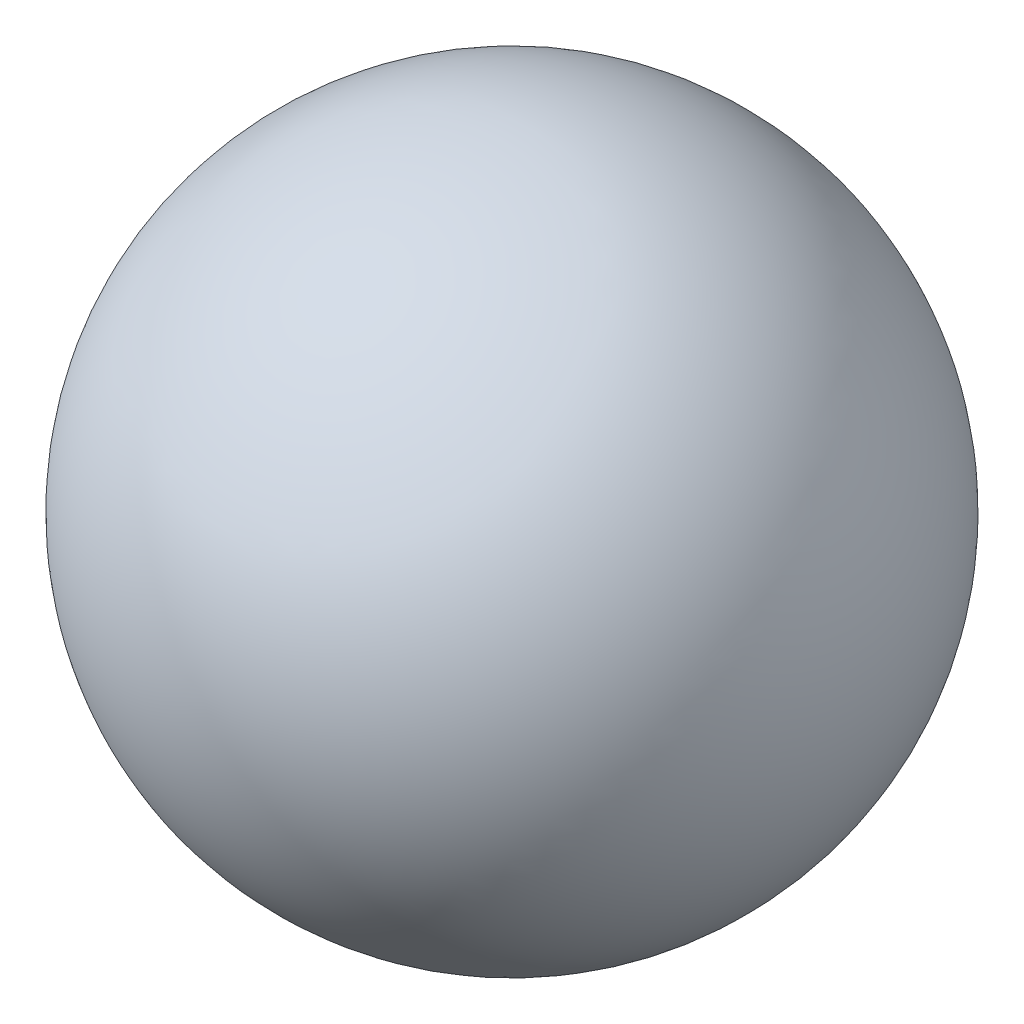
ISO-10303-21;
HEADER;
FILE_DESCRIPTION(('STEP AP214'),'2;1');
FILE_NAME('part.step','',(''),(''),'','','');
FILE_SCHEMA(('AUTOMOTIVE_DESIGN { 1 0 10303 214 1 1 1 1 }'));
ENDSEC;
DATA;
#1=APPLICATION_CONTEXT('core data for automotive mechanical design processes');
#2=APPLICATION_PROTOCOL_DEFINITION('international standard','automotive_design',2000,#1);
#3=PRODUCT_CONTEXT('',#1,'mechanical');
#4=PRODUCT('Part','Part','',(#3));
#5=PRODUCT_RELATED_PRODUCT_CATEGORY('part','',(#4));
#6=PRODUCT_DEFINITION_FORMATION('','',#4);
#7=PRODUCT_DEFINITION_CONTEXT('part definition',#1,'design');
#8=PRODUCT_DEFINITION('design','',#6,#7);
#9=PRODUCT_DEFINITION_SHAPE('','',#8);
#10=(LENGTH_UNIT() NAMED_UNIT(*) SI_UNIT(.MILLI.,.METRE.));
#11=(NAMED_UNIT(*) PLANE_ANGLE_UNIT() SI_UNIT($,.RADIAN.));
#12=(NAMED_UNIT(*) SI_UNIT($,.STERADIAN.) SOLID_ANGLE_UNIT());
#13=UNCERTAINTY_MEASURE_WITH_UNIT(LENGTH_MEASURE(1.E-05),#10,'distance_accuracy_value','');
#14=(GEOMETRIC_REPRESENTATION_CONTEXT(3) GLOBAL_UNCERTAINTY_ASSIGNED_CONTEXT((#13)) GLOBAL_UNIT_ASSIGNED_CONTEXT((#10,
#11,#12)) REPRESENTATION_CONTEXT('',''));
#15=CARTESIAN_POINT('',(0.,0.,0.));
#16=DIRECTION('',(0.,0.,1.));
#17=DIRECTION('',(1.,0.,0.));
#18=AXIS2_PLACEMENT_3D('',#15,#16,#17);
#19=CARTESIAN_POINT('',(0.,0.,0.));
#20=DIRECTION('',(0.,0.,-1.));
#21=DIRECTION('',(1.,0.,0.));
#22=AXIS2_PLACEMENT_3D('',#19,#20,#21);
#23=SPHERICAL_SURFACE('',#22,15.24);
#24=CARTESIAN_POINT('',(0.,0.,-15.24));
#25=VERTEX_POINT('',#24);
#26=VERTEX_LOOP('',#25);
#27=FACE_BOUND('',#26,.T.);
#28=ADVANCED_FACE('F31',(#27),#23,.T.);
#29=CLOSED_SHELL('',(#28));
#30=MANIFOLD_SOLID_BREP('B2',#29);
#31=ADVANCED_BREP_SHAPE_REPRESENTATION('',(#18,#30),#14);
#32=SHAPE_DEFINITION_REPRESENTATION(#9,#31);
ENDSEC;
END-ISO-10303-21;
